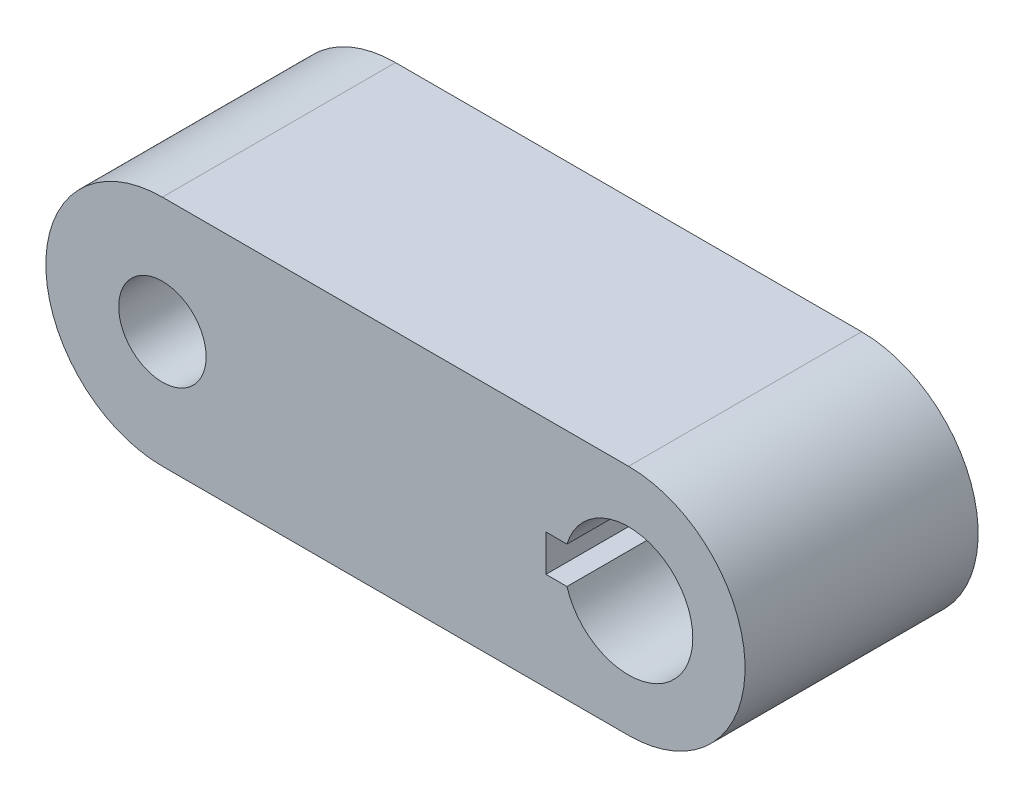
ISO-10303-21;
HEADER;
FILE_DESCRIPTION(('STEP AP214'),'2;1');
FILE_NAME('part.step','',(''),(''),'','','');
FILE_SCHEMA(('AUTOMOTIVE_DESIGN { 1 0 10303 214 1 1 1 1 }'));
ENDSEC;
DATA;
#1=APPLICATION_CONTEXT('core data for automotive mechanical design processes');
#2=APPLICATION_PROTOCOL_DEFINITION('international standard','automotive_design',2000,#1);
#3=PRODUCT_CONTEXT('',#1,'mechanical');
#4=PRODUCT('Part','Part','',(#3));
#5=PRODUCT_RELATED_PRODUCT_CATEGORY('part','',(#4));
#6=PRODUCT_DEFINITION_FORMATION('','',#4);
#7=PRODUCT_DEFINITION_CONTEXT('part definition',#1,'design');
#8=PRODUCT_DEFINITION('design','',#6,#7);
#9=PRODUCT_DEFINITION_SHAPE('','',#8);
#10=(LENGTH_UNIT() NAMED_UNIT(*) SI_UNIT(.MILLI.,.METRE.));
#11=(NAMED_UNIT(*) PLANE_ANGLE_UNIT() SI_UNIT($,.RADIAN.));
#12=(NAMED_UNIT(*) SI_UNIT($,.STERADIAN.) SOLID_ANGLE_UNIT());
#13=UNCERTAINTY_MEASURE_WITH_UNIT(LENGTH_MEASURE(1.E-05),#10,'distance_accuracy_value','');
#14=(GEOMETRIC_REPRESENTATION_CONTEXT(3) GLOBAL_UNCERTAINTY_ASSIGNED_CONTEXT((#13)) GLOBAL_UNIT_ASSIGNED_CONTEXT((#10,
#11,#12)) REPRESENTATION_CONTEXT('',''));
#15=CARTESIAN_POINT('',(0.,0.,0.));
#16=DIRECTION('',(0.,0.,1.));
#17=DIRECTION('',(1.,0.,0.));
#18=AXIS2_PLACEMENT_3D('',#15,#16,#17);
#19=CARTESIAN_POINT('',(0.,0.,6.35));
#20=DIRECTION('',(0.,0.,-1.));
#21=DIRECTION('',(-1.,0.,0.));
#22=AXIS2_PLACEMENT_3D('',#19,#20,#21);
#23=CYLINDRICAL_SURFACE('',#22,6.35);
#24=CARTESIAN_POINT('',(0.,0.,-6.35));
#25=DIRECTION('',(0.,0.,1.));
#26=DIRECTION('',(1.,0.,0.));
#27=AXIS2_PLACEMENT_3D('',#24,#25,#26);
#28=CIRCLE('',#27,6.35);
#29=CARTESIAN_POINT('',(0.,6.35000000000002,-6.35));
#30=VERTEX_POINT('',#29);
#31=CARTESIAN_POINT('',(0.,-6.35000000000002,-6.35));
#32=VERTEX_POINT('',#31);
#33=EDGE_CURVE('E150',#30,#32,#28,.T.);
#34=ORIENTED_EDGE('',*,*,#33,.T.);
#35=DIRECTION('',(0.,0.,-1.));
#36=VECTOR('',#35,1.);
#37=CARTESIAN_POINT('',(0.,-6.35000000000002,6.35));
#38=LINE('',#37,#36);
#39=CARTESIAN_POINT('',(0.,-6.35000000000002,6.35));
#40=VERTEX_POINT('',#39);
#41=EDGE_CURVE('E171',#40,#32,#38,.T.);
#42=ORIENTED_EDGE('',*,*,#41,.F.);
#43=CARTESIAN_POINT('',(0.,0.,6.35));
#44=DIRECTION('',(0.,0.,1.));
#45=DIRECTION('',(1.,0.,0.));
#46=AXIS2_PLACEMENT_3D('',#43,#44,#45);
#47=CIRCLE('',#46,6.35);
#48=CARTESIAN_POINT('',(0.,6.35000000000002,6.35));
#49=VERTEX_POINT('',#48);
#50=EDGE_CURVE('E151',#49,#40,#47,.T.);
#51=ORIENTED_EDGE('',*,*,#50,.F.);
#52=DIRECTION('',(0.,0.,-1.));
#53=VECTOR('',#52,1.);
#54=CARTESIAN_POINT('',(0.,6.35000000000002,6.35));
#55=LINE('',#54,#53);
#56=EDGE_CURVE('E157',#49,#30,#55,.T.);
#57=ORIENTED_EDGE('',*,*,#56,.T.);
#58=EDGE_LOOP('',(#34,#42,#51,#57));
#59=FACE_BOUND('',#58,.T.);
#60=ADVANCED_FACE('F36',(#59),#23,.T.);
#61=CARTESIAN_POINT('',(0.,-6.35000000000002,6.35));
#62=DIRECTION('',(0.,1.,0.));
#63=DIRECTION('',(0.,0.,1.));
#64=AXIS2_PLACEMENT_3D('',#61,#62,#63);
#65=PLANE('',#64);
#66=DIRECTION('',(1.,0.,0.));
#67=VECTOR('',#66,1.);
#68=CARTESIAN_POINT('',(0.,-6.35000000000002,-6.35));
#69=LINE('',#68,#67);
#70=CARTESIAN_POINT('',(25.4000000000001,-6.35000000000004,-6.35));
#71=VERTEX_POINT('',#70);
#72=EDGE_CURVE('E160',#32,#71,#69,.T.);
#73=ORIENTED_EDGE('',*,*,#72,.T.);
#74=DIRECTION('',(0.,0.,-1.));
#75=VECTOR('',#74,1.);
#76=CARTESIAN_POINT('',(25.4000000000001,-6.35000000000004,6.35000000000001));
#77=LINE('',#76,#75);
#78=CARTESIAN_POINT('',(25.4000000000001,-6.35000000000004,6.35000000000001));
#79=VERTEX_POINT('',#78);
#80=EDGE_CURVE('E168',#79,#71,#77,.T.);
#81=ORIENTED_EDGE('',*,*,#80,.F.);
#82=DIRECTION('',(1.,0.,0.));
#83=VECTOR('',#82,1.);
#84=CARTESIAN_POINT('',(0.,-6.35000000000002,6.35));
#85=LINE('',#84,#83);
#86=EDGE_CURVE('E88',#40,#79,#85,.T.);
#87=ORIENTED_EDGE('',*,*,#86,.F.);
#88=ORIENTED_EDGE('',*,*,#41,.T.);
#89=EDGE_LOOP('',(#73,#81,#87,#88));
#90=FACE_BOUND('',#89,.T.);
#91=ADVANCED_FACE('F192',(#90),#65,.F.);
#92=CARTESIAN_POINT('',(25.4000000000001,0.,6.35000000000001));
#93=DIRECTION('',(0.,0.,-1.));
#94=DIRECTION('',(-1.,0.,0.));
#95=AXIS2_PLACEMENT_3D('',#92,#93,#94);
#96=CYLINDRICAL_SURFACE('',#95,6.35);
#97=CARTESIAN_POINT('',(25.4000000000001,0.,-6.35));
#98=DIRECTION('',(0.,0.,1.));
#99=DIRECTION('',(1.,0.,0.));
#100=AXIS2_PLACEMENT_3D('',#97,#98,#99);
#101=CIRCLE('',#100,6.35);
#102=CARTESIAN_POINT('',(25.4000000000001,6.35000000000001,-6.35));
#103=VERTEX_POINT('',#102);
#104=EDGE_CURVE('E162',#71,#103,#101,.T.);
#105=ORIENTED_EDGE('',*,*,#104,.T.);
#106=DIRECTION('',(0.,0.,-1.));
#107=VECTOR('',#106,1.);
#108=CARTESIAN_POINT('',(25.4000000000001,6.35000000000001,6.35000000000001));
#109=LINE('',#108,#107);
#110=CARTESIAN_POINT('',(25.4000000000001,6.35000000000001,6.35000000000001));
#111=VERTEX_POINT('',#110);
#112=EDGE_CURVE('E166',#111,#103,#109,.T.);
#113=ORIENTED_EDGE('',*,*,#112,.F.);
#114=CARTESIAN_POINT('',(25.4000000000001,0.,6.35000000000001));
#115=DIRECTION('',(0.,0.,1.));
#116=DIRECTION('',(1.,0.,0.));
#117=AXIS2_PLACEMENT_3D('',#114,#115,#116);
#118=CIRCLE('',#117,6.35);
#119=EDGE_CURVE('E154',#79,#111,#118,.T.);
#120=ORIENTED_EDGE('',*,*,#119,.F.);
#121=ORIENTED_EDGE('',*,*,#80,.T.);
#122=EDGE_LOOP('',(#105,#113,#120,#121));
#123=FACE_BOUND('',#122,.T.);
#124=ADVANCED_FACE('F197',(#123),#96,.T.);
#125=CARTESIAN_POINT('',(0.,6.35000000000002,6.35));
#126=DIRECTION('',(0.,-1.,0.));
#127=DIRECTION('',(0.,0.,-1.));
#128=AXIS2_PLACEMENT_3D('',#125,#126,#127);
#129=PLANE('',#128);
#130=DIRECTION('',(-1.,0.,0.));
#131=VECTOR('',#130,1.);
#132=CARTESIAN_POINT('',(0.,6.35000000000002,-6.35));
#133=LINE('',#132,#131);
#134=EDGE_CURVE('E80',#103,#30,#133,.T.);
#135=ORIENTED_EDGE('',*,*,#134,.T.);
#136=ORIENTED_EDGE('',*,*,#56,.F.);
#137=DIRECTION('',(-1.,0.,0.));
#138=VECTOR('',#137,1.);
#139=CARTESIAN_POINT('',(0.,6.35000000000002,6.35));
#140=LINE('',#139,#138);
#141=EDGE_CURVE('E59',#111,#49,#140,.T.);
#142=ORIENTED_EDGE('',*,*,#141,.F.);
#143=ORIENTED_EDGE('',*,*,#112,.T.);
#144=EDGE_LOOP('',(#135,#136,#142,#143));
#145=FACE_BOUND('',#144,.T.);
#146=ADVANCED_FACE('F207',(#145),#129,.F.);
#147=CARTESIAN_POINT('',(0.,0.,6.35));
#148=DIRECTION('',(0.,0.,1.));
#149=DIRECTION('',(1.,0.,0.));
#150=AXIS2_PLACEMENT_3D('',#147,#148,#149);
#151=PLANE('',#150);
#152=DIRECTION('',(1.,0.,0.));
#153=VECTOR('',#152,1.);
#154=CARTESIAN_POINT('',(23.4000000000001,-1.00000000000006,6.35000000000001));
#155=LINE('',#154,#153);
#156=CARTESIAN_POINT('',(20.9000000000001,-1.00000000000004,6.35000000000001));
#157=VERTEX_POINT('',#156);
#158=CARTESIAN_POINT('',(22.0458980337504,-0.999999999999987,6.35000000000001));
#159=VERTEX_POINT('',#158);
#160=EDGE_CURVE('E131',#157,#159,#155,.T.);
#161=ORIENTED_EDGE('',*,*,#160,.F.);
#162=DIRECTION('',(0.,-1.,0.));
#163=VECTOR('',#162,1.);
#164=CARTESIAN_POINT('',(20.9000000000001,-1.00000000000004,6.35000000000001));
#165=LINE('',#164,#163);
#166=CARTESIAN_POINT('',(20.9000000000001,1.00000000000004,6.35000000000001));
#167=VERTEX_POINT('',#166);
#168=EDGE_CURVE('E133',#167,#157,#165,.T.);
#169=ORIENTED_EDGE('',*,*,#168,.F.);
#170=DIRECTION('',(-1.,0.,0.));
#171=VECTOR('',#170,1.);
#172=CARTESIAN_POINT('',(23.4000000000001,0.999999999999987,6.35000000000001));
#173=LINE('',#172,#171);
#174=CARTESIAN_POINT('',(22.0458980337504,0.999999999999987,6.35000000000001));
#175=VERTEX_POINT('',#174);
#176=EDGE_CURVE('E112',#175,#167,#173,.T.);
#177=ORIENTED_EDGE('',*,*,#176,.F.);
#178=CARTESIAN_POINT('',(25.4000000000001,0.,6.35000000000001));
#179=DIRECTION('',(0.,0.,1.));
#180=DIRECTION('',(1.,0.,0.));
#181=AXIS2_PLACEMENT_3D('',#178,#179,#180);
#182=CIRCLE('',#181,3.5);
#183=EDGE_CURVE('E139',#159,#175,#182,.T.);
#184=ORIENTED_EDGE('',*,*,#183,.F.);
#185=EDGE_LOOP('',(#161,#169,#177,#184));
#186=FACE_BOUND('',#185,.T.);
#187=CARTESIAN_POINT('',(0.,0.,6.35000000000001));
#188=DIRECTION('',(0.,0.,1.));
#189=DIRECTION('',(1.,0.,0.));
#190=AXIS2_PLACEMENT_3D('',#187,#188,#189);
#191=CIRCLE('',#190,2.38124999999999);
#192=CARTESIAN_POINT('',(2.38124999999999,0.,6.35000000000001));
#193=VERTEX_POINT('',#192);
#194=EDGE_CURVE('E144',#193,#193,#191,.T.);
#195=ORIENTED_EDGE('',*,*,#194,.F.);
#196=EDGE_LOOP('',(#195));
#197=FACE_BOUND('',#196,.T.);
#198=ORIENTED_EDGE('',*,*,#50,.T.);
#199=ORIENTED_EDGE('',*,*,#86,.T.);
#200=ORIENTED_EDGE('',*,*,#119,.T.);
#201=ORIENTED_EDGE('',*,*,#141,.T.);
#202=EDGE_LOOP('',(#198,#199,#200,#201));
#203=FACE_BOUND('',#202,.T.);
#204=ADVANCED_FACE('F177',(#186,#197,#203),#151,.T.);
#205=CARTESIAN_POINT('',(0.,0.,-6.35));
#206=DIRECTION('',(0.,0.,1.));
#207=DIRECTION('',(1.,0.,0.));
#208=AXIS2_PLACEMENT_3D('',#205,#206,#207);
#209=PLANE('',#208);
#210=DIRECTION('',(0.,-1.,0.));
#211=VECTOR('',#210,1.);
#212=CARTESIAN_POINT('',(20.9000000000001,-1.00000000000004,-6.35));
#213=LINE('',#212,#211);
#214=CARTESIAN_POINT('',(20.9000000000001,1.00000000000004,-6.35));
#215=VERTEX_POINT('',#214);
#216=CARTESIAN_POINT('',(20.9000000000001,-1.00000000000004,-6.35));
#217=VERTEX_POINT('',#216);
#218=EDGE_CURVE('E120',#215,#217,#213,.T.);
#219=ORIENTED_EDGE('',*,*,#218,.T.);
#220=DIRECTION('',(1.,0.,0.));
#221=VECTOR('',#220,1.);
#222=CARTESIAN_POINT('',(23.4000000000001,-1.00000000000006,-6.35));
#223=LINE('',#222,#221);
#224=CARTESIAN_POINT('',(22.0458980337504,-0.999999999999987,-6.35));
#225=VERTEX_POINT('',#224);
#226=EDGE_CURVE('E117',#217,#225,#223,.T.);
#227=ORIENTED_EDGE('',*,*,#226,.T.);
#228=CARTESIAN_POINT('',(25.4000000000001,0.,-6.35));
#229=DIRECTION('',(0.,0.,1.));
#230=DIRECTION('',(1.,0.,0.));
#231=AXIS2_PLACEMENT_3D('',#228,#229,#230);
#232=CIRCLE('',#231,3.5);
#233=CARTESIAN_POINT('',(22.0458980337504,0.999999999999987,-6.35));
#234=VERTEX_POINT('',#233);
#235=EDGE_CURVE('E130',#225,#234,#232,.T.);
#236=ORIENTED_EDGE('',*,*,#235,.T.);
#237=DIRECTION('',(-1.,0.,0.));
#238=VECTOR('',#237,1.);
#239=CARTESIAN_POINT('',(23.4000000000001,0.999999999999987,-6.35));
#240=LINE('',#239,#238);
#241=EDGE_CURVE('E50',#234,#215,#240,.T.);
#242=ORIENTED_EDGE('',*,*,#241,.T.);
#243=EDGE_LOOP('',(#219,#227,#236,#242));
#244=FACE_BOUND('',#243,.T.);
#245=CARTESIAN_POINT('',(0.,0.,-6.35));
#246=DIRECTION('',(0.,0.,1.));
#247=DIRECTION('',(1.,0.,0.));
#248=AXIS2_PLACEMENT_3D('',#245,#246,#247);
#249=CIRCLE('',#248,2.38125);
#250=CARTESIAN_POINT('',(2.38125,0.,-6.35));
#251=VERTEX_POINT('',#250);
#252=EDGE_CURVE('E147',#251,#251,#249,.T.);
#253=ORIENTED_EDGE('',*,*,#252,.T.);
#254=EDGE_LOOP('',(#253));
#255=FACE_BOUND('',#254,.T.);
#256=ORIENTED_EDGE('',*,*,#33,.F.);
#257=ORIENTED_EDGE('',*,*,#134,.F.);
#258=ORIENTED_EDGE('',*,*,#104,.F.);
#259=ORIENTED_EDGE('',*,*,#72,.F.);
#260=EDGE_LOOP('',(#256,#257,#258,#259));
#261=FACE_BOUND('',#260,.T.);
#262=ADVANCED_FACE('F127',(#244,#255,#261),#209,.F.);
#263=CARTESIAN_POINT('',(0.,0.,6.35));
#264=DIRECTION('',(0.,0.,1.));
#265=DIRECTION('',(1.,0.,0.));
#266=AXIS2_PLACEMENT_3D('',#263,#264,#265);
#267=CYLINDRICAL_SURFACE('',#266,2.38124999999999);
#268=ORIENTED_EDGE('',*,*,#252,.F.);
#269=EDGE_LOOP('',(#268));
#270=FACE_BOUND('',#269,.T.);
#271=ORIENTED_EDGE('',*,*,#194,.T.);
#272=EDGE_LOOP('',(#271));
#273=FACE_BOUND('',#272,.T.);
#274=ADVANCED_FACE('F188',(#270,#273),#267,.F.);
#275=CARTESIAN_POINT('',(25.4000000000001,0.,6.35000000000001));
#276=DIRECTION('',(0.,0.,1.));
#277=DIRECTION('',(1.,0.,0.));
#278=AXIS2_PLACEMENT_3D('',#275,#276,#277);
#279=CYLINDRICAL_SURFACE('',#278,3.5);
#280=ORIENTED_EDGE('',*,*,#235,.F.);
#281=DIRECTION('',(0.,0.,1.));
#282=VECTOR('',#281,1.);
#283=CARTESIAN_POINT('',(22.0458980337504,-0.999999999999987,6.35000000000001));
#284=LINE('',#283,#282);
#285=EDGE_CURVE('E11',#225,#159,#284,.T.);
#286=ORIENTED_EDGE('',*,*,#285,.T.);
#287=ORIENTED_EDGE('',*,*,#183,.T.);
#288=DIRECTION('',(0.,0.,1.));
#289=VECTOR('',#288,1.);
#290=CARTESIAN_POINT('',(22.0458980337504,0.999999999999987,6.35000000000001));
#291=LINE('',#290,#289);
#292=EDGE_CURVE('E43',#175,#234,#291,.F.);
#293=ORIENTED_EDGE('',*,*,#292,.T.);
#294=EDGE_LOOP('',(#280,#286,#287,#293));
#295=FACE_BOUND('',#294,.T.);
#296=ADVANCED_FACE('F173',(#295),#279,.F.);
#297=CARTESIAN_POINT('',(23.4000000000001,-1.00000000000006,-6.35));
#298=DIRECTION('',(0.,-1.,0.));
#299=DIRECTION('',(1.,0.,0.));
#300=AXIS2_PLACEMENT_3D('',#297,#298,#299);
#301=PLANE('',#300);
#302=ORIENTED_EDGE('',*,*,#226,.F.);
#303=DIRECTION('',(0.,0.,1.));
#304=VECTOR('',#303,1.);
#305=CARTESIAN_POINT('',(20.9000000000001,-1.00000000000004,-6.35));
#306=LINE('',#305,#304);
#307=EDGE_CURVE('E116',#217,#157,#306,.T.);
#308=ORIENTED_EDGE('',*,*,#307,.T.);
#309=ORIENTED_EDGE('',*,*,#160,.T.);
#310=ORIENTED_EDGE('',*,*,#285,.F.);
#311=EDGE_LOOP('',(#302,#308,#309,#310));
#312=FACE_BOUND('',#311,.T.);
#313=ADVANCED_FACE('F180',(#312),#301,.F.);
#314=CARTESIAN_POINT('',(23.4000000000001,0.999999999999987,-6.35));
#315=DIRECTION('',(0.,1.,0.));
#316=DIRECTION('',(-1.,0.,0.));
#317=AXIS2_PLACEMENT_3D('',#314,#315,#316);
#318=PLANE('',#317);
#319=ORIENTED_EDGE('',*,*,#176,.T.);
#320=DIRECTION('',(0.,0.,1.));
#321=VECTOR('',#320,1.);
#322=CARTESIAN_POINT('',(20.9000000000001,1.00000000000004,-6.35));
#323=LINE('',#322,#321);
#324=EDGE_CURVE('E108',#215,#167,#323,.T.);
#325=ORIENTED_EDGE('',*,*,#324,.F.);
#326=ORIENTED_EDGE('',*,*,#241,.F.);
#327=ORIENTED_EDGE('',*,*,#292,.F.);
#328=EDGE_LOOP('',(#319,#325,#326,#327));
#329=FACE_BOUND('',#328,.T.);
#330=ADVANCED_FACE('F110',(#329),#318,.F.);
#331=CARTESIAN_POINT('',(20.9000000000001,-1.00000000000004,-6.35));
#332=DIRECTION('',(-1.,0.,0.));
#333=DIRECTION('',(0.,0.,1.));
#334=AXIS2_PLACEMENT_3D('',#331,#332,#333);
#335=PLANE('',#334);
#336=ORIENTED_EDGE('',*,*,#168,.T.);
#337=ORIENTED_EDGE('',*,*,#307,.F.);
#338=ORIENTED_EDGE('',*,*,#218,.F.);
#339=ORIENTED_EDGE('',*,*,#324,.T.);
#340=EDGE_LOOP('',(#336,#337,#338,#339));
#341=FACE_BOUND('',#340,.T.);
#342=ADVANCED_FACE('F121',(#341),#335,.F.);
#343=CLOSED_SHELL('',(#60,#91,#124,#146,#204,#262,#274,#296,#313,#330,#342));
#344=MANIFOLD_SOLID_BREP('B2',#343);
#345=ADVANCED_BREP_SHAPE_REPRESENTATION('',(#18,#344),#14);
#346=SHAPE_DEFINITION_REPRESENTATION(#9,#345);
ENDSEC;
END-ISO-10303-21;
